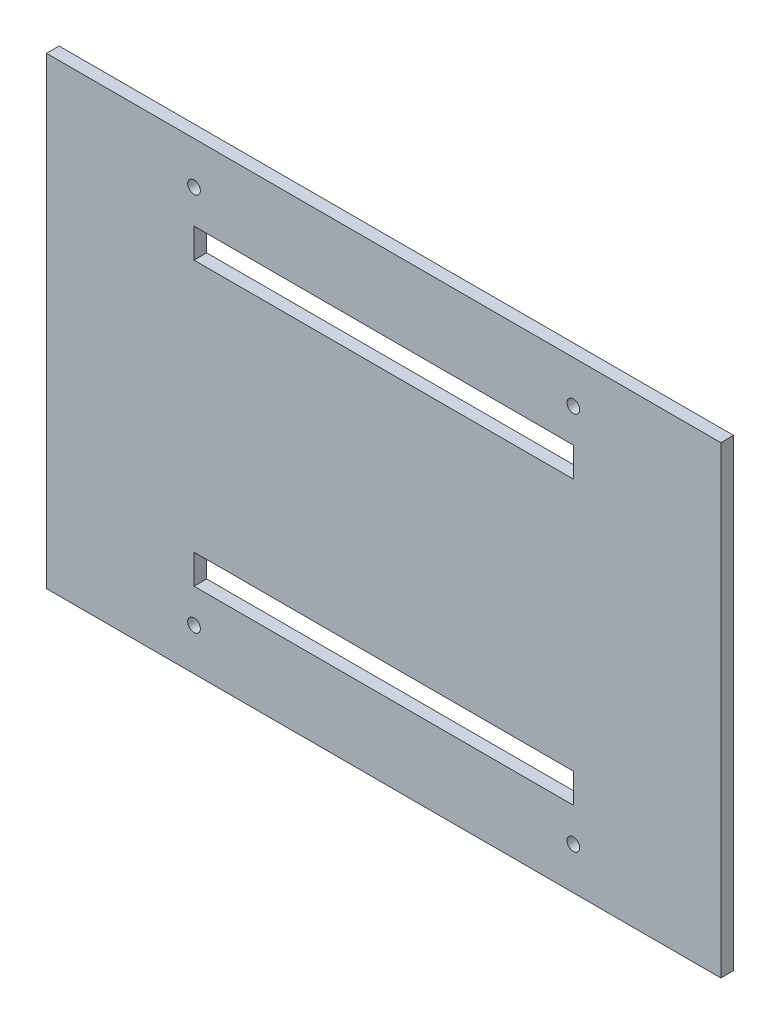
ISO-10303-21;
HEADER;
FILE_DESCRIPTION(('STEP AP214'),'2;1');
FILE_NAME('part.step','',(''),(''),'','','');
FILE_SCHEMA(('AUTOMOTIVE_DESIGN { 1 0 10303 214 1 1 1 1 }'));
ENDSEC;
DATA;
#1=APPLICATION_CONTEXT('core data for automotive mechanical design processes');
#2=APPLICATION_PROTOCOL_DEFINITION('international standard','automotive_design',2000,#1);
#3=PRODUCT_CONTEXT('',#1,'mechanical');
#4=PRODUCT('Part','Part','',(#3));
#5=PRODUCT_RELATED_PRODUCT_CATEGORY('part','',(#4));
#6=PRODUCT_DEFINITION_FORMATION('','',#4);
#7=PRODUCT_DEFINITION_CONTEXT('part definition',#1,'design');
#8=PRODUCT_DEFINITION('design','',#6,#7);
#9=PRODUCT_DEFINITION_SHAPE('','',#8);
#10=(LENGTH_UNIT() NAMED_UNIT(*) SI_UNIT(.MILLI.,.METRE.));
#11=(NAMED_UNIT(*) PLANE_ANGLE_UNIT() SI_UNIT($,.RADIAN.));
#12=(NAMED_UNIT(*) SI_UNIT($,.STERADIAN.) SOLID_ANGLE_UNIT());
#13=UNCERTAINTY_MEASURE_WITH_UNIT(LENGTH_MEASURE(1.E-05),#10,'distance_accuracy_value','');
#14=(GEOMETRIC_REPRESENTATION_CONTEXT(3) GLOBAL_UNCERTAINTY_ASSIGNED_CONTEXT((#13)) GLOBAL_UNIT_ASSIGNED_CONTEXT((#10,
#11,#12)) REPRESENTATION_CONTEXT('',''));
#15=CARTESIAN_POINT('',(0.,0.,0.));
#16=DIRECTION('',(0.,0.,1.));
#17=DIRECTION('',(1.,0.,0.));
#18=AXIS2_PLACEMENT_3D('',#15,#16,#17);
#19=CARTESIAN_POINT('',(0.,0.,3.));
#20=DIRECTION('',(0.,0.,1.));
#21=DIRECTION('',(1.,0.,0.));
#22=AXIS2_PLACEMENT_3D('',#19,#20,#21);
#23=PLANE('',#22);
#24=CARTESIAN_POINT('',(-45.,-45.,3.));
#25=DIRECTION('',(0.,0.,1.));
#26=DIRECTION('',(1.,0.,0.));
#27=AXIS2_PLACEMENT_3D('',#24,#25,#26);
#28=CIRCLE('',#27,1.5);
#29=CARTESIAN_POINT('',(-43.5,-45.,3.));
#30=VERTEX_POINT('',#29);
#31=EDGE_CURVE('E228',#30,#30,#28,.T.);
#32=ORIENTED_EDGE('',*,*,#31,.F.);
#33=EDGE_LOOP('',(#32));
#34=FACE_BOUND('',#33,.T.);
#35=CARTESIAN_POINT('',(45.,45.,3.));
#36=DIRECTION('',(0.,0.,1.));
#37=DIRECTION('',(1.,0.,0.));
#38=AXIS2_PLACEMENT_3D('',#35,#36,#37);
#39=CIRCLE('',#38,1.5);
#40=CARTESIAN_POINT('',(46.5,45.,3.));
#41=VERTEX_POINT('',#40);
#42=EDGE_CURVE('E244',#41,#41,#39,.T.);
#43=ORIENTED_EDGE('',*,*,#42,.F.);
#44=EDGE_LOOP('',(#43));
#45=FACE_BOUND('',#44,.T.);
#46=DIRECTION('',(0.,1.,0.));
#47=VECTOR('',#46,1.);
#48=CARTESIAN_POINT('',(80.,55.,3.));
#49=LINE('',#48,#47);
#50=CARTESIAN_POINT('',(80.,-55.,3.));
#51=VERTEX_POINT('',#50);
#52=CARTESIAN_POINT('',(80.,55.,3.));
#53=VERTEX_POINT('',#52);
#54=EDGE_CURVE('E252',#51,#53,#49,.T.);
#55=ORIENTED_EDGE('',*,*,#54,.T.);
#56=DIRECTION('',(-1.,0.,0.));
#57=VECTOR('',#56,1.);
#58=CARTESIAN_POINT('',(-80.,55.,3.));
#59=LINE('',#58,#57);
#60=CARTESIAN_POINT('',(-80.,55.,3.));
#61=VERTEX_POINT('',#60);
#62=EDGE_CURVE('E256',#53,#61,#59,.T.);
#63=ORIENTED_EDGE('',*,*,#62,.T.);
#64=DIRECTION('',(0.,-1.,0.));
#65=VECTOR('',#64,1.);
#66=CARTESIAN_POINT('',(-80.,55.,3.));
#67=LINE('',#66,#65);
#68=CARTESIAN_POINT('',(-80.,-55.,3.));
#69=VERTEX_POINT('',#68);
#70=EDGE_CURVE('E260',#61,#69,#67,.T.);
#71=ORIENTED_EDGE('',*,*,#70,.T.);
#72=DIRECTION('',(1.,0.,0.));
#73=VECTOR('',#72,1.);
#74=CARTESIAN_POINT('',(-80.,-55.,3.));
#75=LINE('',#74,#73);
#76=EDGE_CURVE('E263',#69,#51,#75,.T.);
#77=ORIENTED_EDGE('',*,*,#76,.T.);
#78=EDGE_LOOP('',(#55,#63,#71,#77));
#79=FACE_BOUND('',#78,.T.);
#80=CARTESIAN_POINT('',(-45.,45.,3.));
#81=DIRECTION('',(0.,0.,1.));
#82=DIRECTION('',(1.,0.,0.));
#83=AXIS2_PLACEMENT_3D('',#80,#81,#82);
#84=CIRCLE('',#83,1.5);
#85=CARTESIAN_POINT('',(-43.5,45.,3.));
#86=VERTEX_POINT('',#85);
#87=EDGE_CURVE('E236',#86,#86,#84,.T.);
#88=ORIENTED_EDGE('',*,*,#87,.F.);
#89=EDGE_LOOP('',(#88));
#90=FACE_BOUND('',#89,.T.);
#91=CARTESIAN_POINT('',(45.,-45.,3.));
#92=DIRECTION('',(0.,0.,1.));
#93=DIRECTION('',(1.,0.,0.));
#94=AXIS2_PLACEMENT_3D('',#91,#92,#93);
#95=CIRCLE('',#94,1.5);
#96=CARTESIAN_POINT('',(46.5,-45.,3.));
#97=VERTEX_POINT('',#96);
#98=EDGE_CURVE('E220',#97,#97,#95,.T.);
#99=ORIENTED_EDGE('',*,*,#98,.F.);
#100=EDGE_LOOP('',(#99));
#101=FACE_BOUND('',#100,.T.);
#102=DIRECTION('',(1.,0.,0.));
#103=VECTOR('',#102,1.);
#104=CARTESIAN_POINT('',(-45.,30.,3.));
#105=LINE('',#104,#103);
#106=CARTESIAN_POINT('',(-45.,30.,3.));
#107=VERTEX_POINT('',#106);
#108=CARTESIAN_POINT('',(45.,30.,3.));
#109=VERTEX_POINT('',#108);
#110=EDGE_CURVE('E180',#107,#109,#105,.T.);
#111=ORIENTED_EDGE('',*,*,#110,.F.);
#112=DIRECTION('',(0.,-1.,0.));
#113=VECTOR('',#112,1.);
#114=CARTESIAN_POINT('',(-45.,37.,3.));
#115=LINE('',#114,#113);
#116=CARTESIAN_POINT('',(-45.,37.,3.));
#117=VERTEX_POINT('',#116);
#118=EDGE_CURVE('E177',#117,#107,#115,.T.);
#119=ORIENTED_EDGE('',*,*,#118,.F.);
#120=DIRECTION('',(-1.,0.,0.));
#121=VECTOR('',#120,1.);
#122=CARTESIAN_POINT('',(-45.,37.,3.));
#123=LINE('',#122,#121);
#124=CARTESIAN_POINT('',(45.,37.,3.));
#125=VERTEX_POINT('',#124);
#126=EDGE_CURVE('E188',#125,#117,#123,.T.);
#127=ORIENTED_EDGE('',*,*,#126,.F.);
#128=DIRECTION('',(0.,1.,0.));
#129=VECTOR('',#128,1.);
#130=CARTESIAN_POINT('',(45.,37.,3.));
#131=LINE('',#130,#129);
#132=EDGE_CURVE('E184',#109,#125,#131,.T.);
#133=ORIENTED_EDGE('',*,*,#132,.F.);
#134=EDGE_LOOP('',(#111,#119,#127,#133));
#135=FACE_BOUND('',#134,.T.);
#136=DIRECTION('',(1.,0.,0.));
#137=VECTOR('',#136,1.);
#138=CARTESIAN_POINT('',(-45.,-37.,3.));
#139=LINE('',#138,#137);
#140=CARTESIAN_POINT('',(-45.,-37.,3.));
#141=VERTEX_POINT('',#140);
#142=CARTESIAN_POINT('',(45.,-37.,3.));
#143=VERTEX_POINT('',#142);
#144=EDGE_CURVE('E138',#141,#143,#139,.T.);
#145=ORIENTED_EDGE('',*,*,#144,.F.);
#146=DIRECTION('',(0.,-1.,0.));
#147=VECTOR('',#146,1.);
#148=CARTESIAN_POINT('',(-45.,-30.,3.));
#149=LINE('',#148,#147);
#150=CARTESIAN_POINT('',(-45.,-30.,3.));
#151=VERTEX_POINT('',#150);
#152=EDGE_CURVE('E129',#151,#141,#149,.T.);
#153=ORIENTED_EDGE('',*,*,#152,.F.);
#154=DIRECTION('',(-1.,0.,0.));
#155=VECTOR('',#154,1.);
#156=CARTESIAN_POINT('',(-45.,-30.,3.));
#157=LINE('',#156,#155);
#158=CARTESIAN_POINT('',(45.,-30.,3.));
#159=VERTEX_POINT('',#158);
#160=EDGE_CURVE('E155',#159,#151,#157,.T.);
#161=ORIENTED_EDGE('',*,*,#160,.F.);
#162=DIRECTION('',(0.,1.,0.));
#163=VECTOR('',#162,1.);
#164=CARTESIAN_POINT('',(45.,-30.,3.));
#165=LINE('',#164,#163);
#166=EDGE_CURVE('E151',#143,#159,#165,.T.);
#167=ORIENTED_EDGE('',*,*,#166,.F.);
#168=EDGE_LOOP('',(#145,#153,#161,#167));
#169=FACE_BOUND('',#168,.T.);
#170=ADVANCED_FACE('F39',(#34,#45,#79,#90,#101,#135,#169),#23,.T.);
#171=CARTESIAN_POINT('',(0.,0.,0.));
#172=DIRECTION('',(0.,0.,1.));
#173=DIRECTION('',(1.,0.,0.));
#174=AXIS2_PLACEMENT_3D('',#171,#172,#173);
#175=PLANE('',#174);
#176=DIRECTION('',(0.,-1.,0.));
#177=VECTOR('',#176,1.);
#178=CARTESIAN_POINT('',(-45.,37.,0.));
#179=LINE('',#178,#177);
#180=CARTESIAN_POINT('',(-45.,37.,0.));
#181=VERTEX_POINT('',#180);
#182=CARTESIAN_POINT('',(-45.,30.,0.));
#183=VERTEX_POINT('',#182);
#184=EDGE_CURVE('E147',#181,#183,#179,.T.);
#185=ORIENTED_EDGE('',*,*,#184,.T.);
#186=DIRECTION('',(1.,0.,0.));
#187=VECTOR('',#186,1.);
#188=CARTESIAN_POINT('',(-45.,30.,0.));
#189=LINE('',#188,#187);
#190=CARTESIAN_POINT('',(45.,30.,0.));
#191=VERTEX_POINT('',#190);
#192=EDGE_CURVE('E195',#183,#191,#189,.T.);
#193=ORIENTED_EDGE('',*,*,#192,.T.);
#194=DIRECTION('',(0.,1.,0.));
#195=VECTOR('',#194,1.);
#196=CARTESIAN_POINT('',(45.,37.,0.));
#197=LINE('',#196,#195);
#198=CARTESIAN_POINT('',(45.,37.,0.));
#199=VERTEX_POINT('',#198);
#200=EDGE_CURVE('E199',#191,#199,#197,.T.);
#201=ORIENTED_EDGE('',*,*,#200,.T.);
#202=DIRECTION('',(-1.,0.,0.));
#203=VECTOR('',#202,1.);
#204=CARTESIAN_POINT('',(-45.,37.,0.));
#205=LINE('',#204,#203);
#206=EDGE_CURVE('E181',#199,#181,#205,.T.);
#207=ORIENTED_EDGE('',*,*,#206,.T.);
#208=EDGE_LOOP('',(#185,#193,#201,#207));
#209=FACE_BOUND('',#208,.T.);
#210=DIRECTION('',(0.,1.,0.));
#211=VECTOR('',#210,1.);
#212=CARTESIAN_POINT('',(80.,55.,0.));
#213=LINE('',#212,#211);
#214=CARTESIAN_POINT('',(80.,-55.,0.));
#215=VERTEX_POINT('',#214);
#216=CARTESIAN_POINT('',(80.,55.,0.));
#217=VERTEX_POINT('',#216);
#218=EDGE_CURVE('E248',#215,#217,#213,.T.);
#219=ORIENTED_EDGE('',*,*,#218,.F.);
#220=DIRECTION('',(1.,0.,0.));
#221=VECTOR('',#220,1.);
#222=CARTESIAN_POINT('',(-80.,-55.,0.));
#223=LINE('',#222,#221);
#224=CARTESIAN_POINT('',(-80.,-55.,0.));
#225=VERTEX_POINT('',#224);
#226=EDGE_CURVE('E257',#225,#215,#223,.T.);
#227=ORIENTED_EDGE('',*,*,#226,.F.);
#228=DIRECTION('',(0.,-1.,0.));
#229=VECTOR('',#228,1.);
#230=CARTESIAN_POINT('',(-80.,55.,0.));
#231=LINE('',#230,#229);
#232=CARTESIAN_POINT('',(-80.,55.,0.));
#233=VERTEX_POINT('',#232);
#234=EDGE_CURVE('E273',#233,#225,#231,.T.);
#235=ORIENTED_EDGE('',*,*,#234,.F.);
#236=DIRECTION('',(-1.,0.,0.));
#237=VECTOR('',#236,1.);
#238=CARTESIAN_POINT('',(-80.,55.,0.));
#239=LINE('',#238,#237);
#240=EDGE_CURVE('E270',#217,#233,#239,.T.);
#241=ORIENTED_EDGE('',*,*,#240,.F.);
#242=EDGE_LOOP('',(#219,#227,#235,#241));
#243=FACE_BOUND('',#242,.T.);
#244=CARTESIAN_POINT('',(45.,45.,0.));
#245=DIRECTION('',(0.,0.,1.));
#246=DIRECTION('',(1.,0.,0.));
#247=AXIS2_PLACEMENT_3D('',#244,#245,#246);
#248=CIRCLE('',#247,1.5);
#249=CARTESIAN_POINT('',(46.5,45.,0.));
#250=VERTEX_POINT('',#249);
#251=EDGE_CURVE('E240',#250,#250,#248,.T.);
#252=ORIENTED_EDGE('',*,*,#251,.T.);
#253=EDGE_LOOP('',(#252));
#254=FACE_BOUND('',#253,.T.);
#255=CARTESIAN_POINT('',(-45.,45.,0.));
#256=DIRECTION('',(0.,0.,1.));
#257=DIRECTION('',(1.,0.,0.));
#258=AXIS2_PLACEMENT_3D('',#255,#256,#257);
#259=CIRCLE('',#258,1.5);
#260=CARTESIAN_POINT('',(-43.5,45.,0.));
#261=VERTEX_POINT('',#260);
#262=EDGE_CURVE('E232',#261,#261,#259,.T.);
#263=ORIENTED_EDGE('',*,*,#262,.T.);
#264=EDGE_LOOP('',(#263));
#265=FACE_BOUND('',#264,.T.);
#266=CARTESIAN_POINT('',(-45.,-45.,0.));
#267=DIRECTION('',(0.,0.,1.));
#268=DIRECTION('',(1.,0.,0.));
#269=AXIS2_PLACEMENT_3D('',#266,#267,#268);
#270=CIRCLE('',#269,1.5);
#271=CARTESIAN_POINT('',(-43.5,-45.,0.));
#272=VERTEX_POINT('',#271);
#273=EDGE_CURVE('E224',#272,#272,#270,.T.);
#274=ORIENTED_EDGE('',*,*,#273,.T.);
#275=EDGE_LOOP('',(#274));
#276=FACE_BOUND('',#275,.T.);
#277=CARTESIAN_POINT('',(45.,-45.,0.));
#278=DIRECTION('',(0.,0.,1.));
#279=DIRECTION('',(1.,0.,0.));
#280=AXIS2_PLACEMENT_3D('',#277,#278,#279);
#281=CIRCLE('',#280,1.5);
#282=CARTESIAN_POINT('',(46.5,-45.,0.));
#283=VERTEX_POINT('',#282);
#284=EDGE_CURVE('E219',#283,#283,#281,.T.);
#285=ORIENTED_EDGE('',*,*,#284,.T.);
#286=EDGE_LOOP('',(#285));
#287=FACE_BOUND('',#286,.T.);
#288=DIRECTION('',(0.,-1.,0.));
#289=VECTOR('',#288,1.);
#290=CARTESIAN_POINT('',(-45.,-30.,0.));
#291=LINE('',#290,#289);
#292=CARTESIAN_POINT('',(-45.,-30.,0.));
#293=VERTEX_POINT('',#292);
#294=CARTESIAN_POINT('',(-45.,-37.,0.));
#295=VERTEX_POINT('',#294);
#296=EDGE_CURVE('E63',#293,#295,#291,.T.);
#297=ORIENTED_EDGE('',*,*,#296,.T.);
#298=DIRECTION('',(1.,0.,0.));
#299=VECTOR('',#298,1.);
#300=CARTESIAN_POINT('',(-45.,-37.,0.));
#301=LINE('',#300,#299);
#302=CARTESIAN_POINT('',(45.,-37.,0.));
#303=VERTEX_POINT('',#302);
#304=EDGE_CURVE('E145',#295,#303,#301,.T.);
#305=ORIENTED_EDGE('',*,*,#304,.T.);
#306=DIRECTION('',(0.,1.,0.));
#307=VECTOR('',#306,1.);
#308=CARTESIAN_POINT('',(45.,-30.,0.));
#309=LINE('',#308,#307);
#310=CARTESIAN_POINT('',(45.,-30.,0.));
#311=VERTEX_POINT('',#310);
#312=EDGE_CURVE('E164',#303,#311,#309,.T.);
#313=ORIENTED_EDGE('',*,*,#312,.T.);
#314=DIRECTION('',(-1.,0.,0.));
#315=VECTOR('',#314,1.);
#316=CARTESIAN_POINT('',(-45.,-30.,0.));
#317=LINE('',#316,#315);
#318=EDGE_CURVE('E139',#311,#293,#317,.T.);
#319=ORIENTED_EDGE('',*,*,#318,.T.);
#320=EDGE_LOOP('',(#297,#305,#313,#319));
#321=FACE_BOUND('',#320,.T.);
#322=ADVANCED_FACE('F296',(#209,#243,#254,#265,#276,#287,#321),#175,.F.);
#323=CARTESIAN_POINT('',(80.,55.,3.));
#324=DIRECTION('',(-1.,0.,0.));
#325=DIRECTION('',(0.,0.,1.));
#326=AXIS2_PLACEMENT_3D('',#323,#324,#325);
#327=PLANE('',#326);
#328=ORIENTED_EDGE('',*,*,#218,.T.);
#329=DIRECTION('',(0.,0.,-1.));
#330=VECTOR('',#329,1.);
#331=CARTESIAN_POINT('',(80.,55.,3.));
#332=LINE('',#331,#330);
#333=EDGE_CURVE('E11',#53,#217,#332,.T.);
#334=ORIENTED_EDGE('',*,*,#333,.F.);
#335=ORIENTED_EDGE('',*,*,#54,.F.);
#336=DIRECTION('',(0.,0.,-1.));
#337=VECTOR('',#336,1.);
#338=CARTESIAN_POINT('',(80.,-55.,3.));
#339=LINE('',#338,#337);
#340=EDGE_CURVE('E266',#51,#215,#339,.T.);
#341=ORIENTED_EDGE('',*,*,#340,.T.);
#342=EDGE_LOOP('',(#328,#334,#335,#341));
#343=FACE_BOUND('',#342,.T.);
#344=ADVANCED_FACE('F41',(#343),#327,.F.);
#345=CARTESIAN_POINT('',(-80.,55.,3.));
#346=DIRECTION('',(0.,-1.,0.));
#347=DIRECTION('',(0.,0.,-1.));
#348=AXIS2_PLACEMENT_3D('',#345,#346,#347);
#349=PLANE('',#348);
#350=ORIENTED_EDGE('',*,*,#240,.T.);
#351=DIRECTION('',(0.,0.,-1.));
#352=VECTOR('',#351,1.);
#353=CARTESIAN_POINT('',(-80.,55.,3.));
#354=LINE('',#353,#352);
#355=EDGE_CURVE('E48',#61,#233,#354,.T.);
#356=ORIENTED_EDGE('',*,*,#355,.F.);
#357=ORIENTED_EDGE('',*,*,#62,.F.);
#358=ORIENTED_EDGE('',*,*,#333,.T.);
#359=EDGE_LOOP('',(#350,#356,#357,#358));
#360=FACE_BOUND('',#359,.T.);
#361=ADVANCED_FACE('F307',(#360),#349,.F.);
#362=CARTESIAN_POINT('',(-80.,55.,3.));
#363=DIRECTION('',(1.,0.,0.));
#364=DIRECTION('',(0.,0.,-1.));
#365=AXIS2_PLACEMENT_3D('',#362,#363,#364);
#366=PLANE('',#365);
#367=ORIENTED_EDGE('',*,*,#234,.T.);
#368=DIRECTION('',(0.,0.,-1.));
#369=VECTOR('',#368,1.);
#370=CARTESIAN_POINT('',(-80.,-55.,3.));
#371=LINE('',#370,#369);
#372=EDGE_CURVE('E281',#69,#225,#371,.T.);
#373=ORIENTED_EDGE('',*,*,#372,.F.);
#374=ORIENTED_EDGE('',*,*,#70,.F.);
#375=ORIENTED_EDGE('',*,*,#355,.T.);
#376=EDGE_LOOP('',(#367,#373,#374,#375));
#377=FACE_BOUND('',#376,.T.);
#378=ADVANCED_FACE('F290',(#377),#366,.F.);
#379=CARTESIAN_POINT('',(-80.,-55.,3.));
#380=DIRECTION('',(0.,1.,0.));
#381=DIRECTION('',(0.,0.,1.));
#382=AXIS2_PLACEMENT_3D('',#379,#380,#381);
#383=PLANE('',#382);
#384=ORIENTED_EDGE('',*,*,#226,.T.);
#385=ORIENTED_EDGE('',*,*,#340,.F.);
#386=ORIENTED_EDGE('',*,*,#76,.F.);
#387=ORIENTED_EDGE('',*,*,#372,.T.);
#388=EDGE_LOOP('',(#384,#385,#386,#387));
#389=FACE_BOUND('',#388,.T.);
#390=ADVANCED_FACE('F300',(#389),#383,.F.);
#391=CARTESIAN_POINT('',(45.,45.,3.));
#392=DIRECTION('',(0.,0.,-1.));
#393=DIRECTION('',(-1.,0.,0.));
#394=AXIS2_PLACEMENT_3D('',#391,#392,#393);
#395=CYLINDRICAL_SURFACE('',#394,1.5);
#396=ORIENTED_EDGE('',*,*,#42,.T.);
#397=EDGE_LOOP('',(#396));
#398=FACE_BOUND('',#397,.T.);
#399=ORIENTED_EDGE('',*,*,#251,.F.);
#400=EDGE_LOOP('',(#399));
#401=FACE_BOUND('',#400,.T.);
#402=ADVANCED_FACE('F325',(#398,#401),#395,.F.);
#403=CARTESIAN_POINT('',(-45.,45.,3.));
#404=DIRECTION('',(0.,0.,-1.));
#405=DIRECTION('',(-1.,0.,0.));
#406=AXIS2_PLACEMENT_3D('',#403,#404,#405);
#407=CYLINDRICAL_SURFACE('',#406,1.5);
#408=ORIENTED_EDGE('',*,*,#87,.T.);
#409=EDGE_LOOP('',(#408));
#410=FACE_BOUND('',#409,.T.);
#411=ORIENTED_EDGE('',*,*,#262,.F.);
#412=EDGE_LOOP('',(#411));
#413=FACE_BOUND('',#412,.T.);
#414=ADVANCED_FACE('F332',(#410,#413),#407,.F.);
#415=CARTESIAN_POINT('',(-45.,-45.,3.));
#416=DIRECTION('',(0.,0.,-1.));
#417=DIRECTION('',(-1.,0.,0.));
#418=AXIS2_PLACEMENT_3D('',#415,#416,#417);
#419=CYLINDRICAL_SURFACE('',#418,1.5);
#420=ORIENTED_EDGE('',*,*,#31,.T.);
#421=EDGE_LOOP('',(#420));
#422=FACE_BOUND('',#421,.T.);
#423=ORIENTED_EDGE('',*,*,#273,.F.);
#424=EDGE_LOOP('',(#423));
#425=FACE_BOUND('',#424,.T.);
#426=ADVANCED_FACE('F337',(#422,#425),#419,.F.);
#427=CARTESIAN_POINT('',(45.,-45.,3.));
#428=DIRECTION('',(0.,0.,-1.));
#429=DIRECTION('',(-1.,0.,0.));
#430=AXIS2_PLACEMENT_3D('',#427,#428,#429);
#431=CYLINDRICAL_SURFACE('',#430,1.5);
#432=ORIENTED_EDGE('',*,*,#98,.T.);
#433=EDGE_LOOP('',(#432));
#434=FACE_BOUND('',#433,.T.);
#435=ORIENTED_EDGE('',*,*,#284,.F.);
#436=EDGE_LOOP('',(#435));
#437=FACE_BOUND('',#436,.T.);
#438=ADVANCED_FACE('F379',(#434,#437),#431,.F.);
#439=CARTESIAN_POINT('',(-45.,37.,3.));
#440=DIRECTION('',(1.,0.,0.));
#441=DIRECTION('',(0.,0.,-1.));
#442=AXIS2_PLACEMENT_3D('',#439,#440,#441);
#443=PLANE('',#442);
#444=ORIENTED_EDGE('',*,*,#184,.F.);
#445=DIRECTION('',(0.,0.,-1.));
#446=VECTOR('',#445,1.);
#447=CARTESIAN_POINT('',(-45.,37.,3.));
#448=LINE('',#447,#446);
#449=EDGE_CURVE('E191',#117,#181,#448,.T.);
#450=ORIENTED_EDGE('',*,*,#449,.F.);
#451=ORIENTED_EDGE('',*,*,#118,.T.);
#452=DIRECTION('',(0.,0.,-1.));
#453=VECTOR('',#452,1.);
#454=CARTESIAN_POINT('',(-45.,30.,3.));
#455=LINE('',#454,#453);
#456=EDGE_CURVE('E215',#107,#183,#455,.T.);
#457=ORIENTED_EDGE('',*,*,#456,.T.);
#458=EDGE_LOOP('',(#444,#450,#451,#457));
#459=FACE_BOUND('',#458,.T.);
#460=ADVANCED_FACE('F375',(#459),#443,.T.);
#461=CARTESIAN_POINT('',(-45.,30.,3.));
#462=DIRECTION('',(0.,1.,0.));
#463=DIRECTION('',(0.,0.,1.));
#464=AXIS2_PLACEMENT_3D('',#461,#462,#463);
#465=PLANE('',#464);
#466=ORIENTED_EDGE('',*,*,#192,.F.);
#467=ORIENTED_EDGE('',*,*,#456,.F.);
#468=ORIENTED_EDGE('',*,*,#110,.T.);
#469=DIRECTION('',(0.,0.,-1.));
#470=VECTOR('',#469,1.);
#471=CARTESIAN_POINT('',(45.,30.,3.));
#472=LINE('',#471,#470);
#473=EDGE_CURVE('E212',#109,#191,#472,.T.);
#474=ORIENTED_EDGE('',*,*,#473,.T.);
#475=EDGE_LOOP('',(#466,#467,#468,#474));
#476=FACE_BOUND('',#475,.T.);
#477=ADVANCED_FACE('F371',(#476),#465,.T.);
#478=CARTESIAN_POINT('',(45.,37.,3.));
#479=DIRECTION('',(-1.,0.,0.));
#480=DIRECTION('',(0.,0.,1.));
#481=AXIS2_PLACEMENT_3D('',#478,#479,#480);
#482=PLANE('',#481);
#483=ORIENTED_EDGE('',*,*,#200,.F.);
#484=ORIENTED_EDGE('',*,*,#473,.F.);
#485=ORIENTED_EDGE('',*,*,#132,.T.);
#486=DIRECTION('',(0.,0.,-1.));
#487=VECTOR('',#486,1.);
#488=CARTESIAN_POINT('',(45.,37.,3.));
#489=LINE('',#488,#487);
#490=EDGE_CURVE('E209',#125,#199,#489,.T.);
#491=ORIENTED_EDGE('',*,*,#490,.T.);
#492=EDGE_LOOP('',(#483,#484,#485,#491));
#493=FACE_BOUND('',#492,.T.);
#494=ADVANCED_FACE('F367',(#493),#482,.T.);
#495=CARTESIAN_POINT('',(-45.,37.,3.));
#496=DIRECTION('',(0.,-1.,0.));
#497=DIRECTION('',(0.,0.,-1.));
#498=AXIS2_PLACEMENT_3D('',#495,#496,#497);
#499=PLANE('',#498);
#500=ORIENTED_EDGE('',*,*,#206,.F.);
#501=ORIENTED_EDGE('',*,*,#490,.F.);
#502=ORIENTED_EDGE('',*,*,#126,.T.);
#503=ORIENTED_EDGE('',*,*,#449,.T.);
#504=EDGE_LOOP('',(#500,#501,#502,#503));
#505=FACE_BOUND('',#504,.T.);
#506=ADVANCED_FACE('F364',(#505),#499,.T.);
#507=CARTESIAN_POINT('',(-45.,-30.,3.));
#508=DIRECTION('',(1.,0.,0.));
#509=DIRECTION('',(0.,1.,0.));
#510=AXIS2_PLACEMENT_3D('',#507,#508,#509);
#511=PLANE('',#510);
#512=ORIENTED_EDGE('',*,*,#296,.F.);
#513=DIRECTION('',(0.,0.,-1.));
#514=VECTOR('',#513,1.);
#515=CARTESIAN_POINT('',(-45.,-30.,3.));
#516=LINE('',#515,#514);
#517=EDGE_CURVE('E133',#151,#293,#516,.T.);
#518=ORIENTED_EDGE('',*,*,#517,.F.);
#519=ORIENTED_EDGE('',*,*,#152,.T.);
#520=DIRECTION('',(0.,0.,-1.));
#521=VECTOR('',#520,1.);
#522=CARTESIAN_POINT('',(-45.,-37.,3.));
#523=LINE('',#522,#521);
#524=EDGE_CURVE('E132',#141,#295,#523,.T.);
#525=ORIENTED_EDGE('',*,*,#524,.T.);
#526=EDGE_LOOP('',(#512,#518,#519,#525));
#527=FACE_BOUND('',#526,.T.);
#528=ADVANCED_FACE('F131',(#527),#511,.T.);
#529=CARTESIAN_POINT('',(-45.,-37.,3.));
#530=DIRECTION('',(0.,1.,0.));
#531=DIRECTION('',(0.,0.,1.));
#532=AXIS2_PLACEMENT_3D('',#529,#530,#531);
#533=PLANE('',#532);
#534=ORIENTED_EDGE('',*,*,#304,.F.);
#535=ORIENTED_EDGE('',*,*,#524,.F.);
#536=ORIENTED_EDGE('',*,*,#144,.T.);
#537=DIRECTION('',(0.,0.,-1.));
#538=VECTOR('',#537,1.);
#539=CARTESIAN_POINT('',(45.,-37.,3.));
#540=LINE('',#539,#538);
#541=EDGE_CURVE('E148',#143,#303,#540,.T.);
#542=ORIENTED_EDGE('',*,*,#541,.T.);
#543=EDGE_LOOP('',(#534,#535,#536,#542));
#544=FACE_BOUND('',#543,.T.);
#545=ADVANCED_FACE('F142',(#544),#533,.T.);
#546=CARTESIAN_POINT('',(45.,-30.,3.));
#547=DIRECTION('',(-1.,0.,0.));
#548=DIRECTION('',(0.,0.,1.));
#549=AXIS2_PLACEMENT_3D('',#546,#547,#548);
#550=PLANE('',#549);
#551=ORIENTED_EDGE('',*,*,#312,.F.);
#552=ORIENTED_EDGE('',*,*,#541,.F.);
#553=ORIENTED_EDGE('',*,*,#166,.T.);
#554=DIRECTION('',(0.,0.,-1.));
#555=VECTOR('',#554,1.);
#556=CARTESIAN_POINT('',(45.,-30.,3.));
#557=LINE('',#556,#555);
#558=EDGE_CURVE('E55',#159,#311,#557,.T.);
#559=ORIENTED_EDGE('',*,*,#558,.T.);
#560=EDGE_LOOP('',(#551,#552,#553,#559));
#561=FACE_BOUND('',#560,.T.);
#562=ADVANCED_FACE('F352',(#561),#550,.T.);
#563=CARTESIAN_POINT('',(-45.,-30.,3.));
#564=DIRECTION('',(0.,-1.,0.));
#565=DIRECTION('',(0.,0.,-1.));
#566=AXIS2_PLACEMENT_3D('',#563,#564,#565);
#567=PLANE('',#566);
#568=ORIENTED_EDGE('',*,*,#318,.F.);
#569=ORIENTED_EDGE('',*,*,#558,.F.);
#570=ORIENTED_EDGE('',*,*,#160,.T.);
#571=ORIENTED_EDGE('',*,*,#517,.T.);
#572=EDGE_LOOP('',(#568,#569,#570,#571));
#573=FACE_BOUND('',#572,.T.);
#574=ADVANCED_FACE('F350',(#573),#567,.T.);
#575=CLOSED_SHELL('',(#170,#322,#344,#361,#378,#390,#402,#414,#426,#438,#460,#477,#494,#506,
#528,#545,#562,#574));
#576=MANIFOLD_SOLID_BREP('B2',#575);
#577=ADVANCED_BREP_SHAPE_REPRESENTATION('',(#18,#576),#14);
#578=SHAPE_DEFINITION_REPRESENTATION(#9,#577);
ENDSEC;
END-ISO-10303-21;
